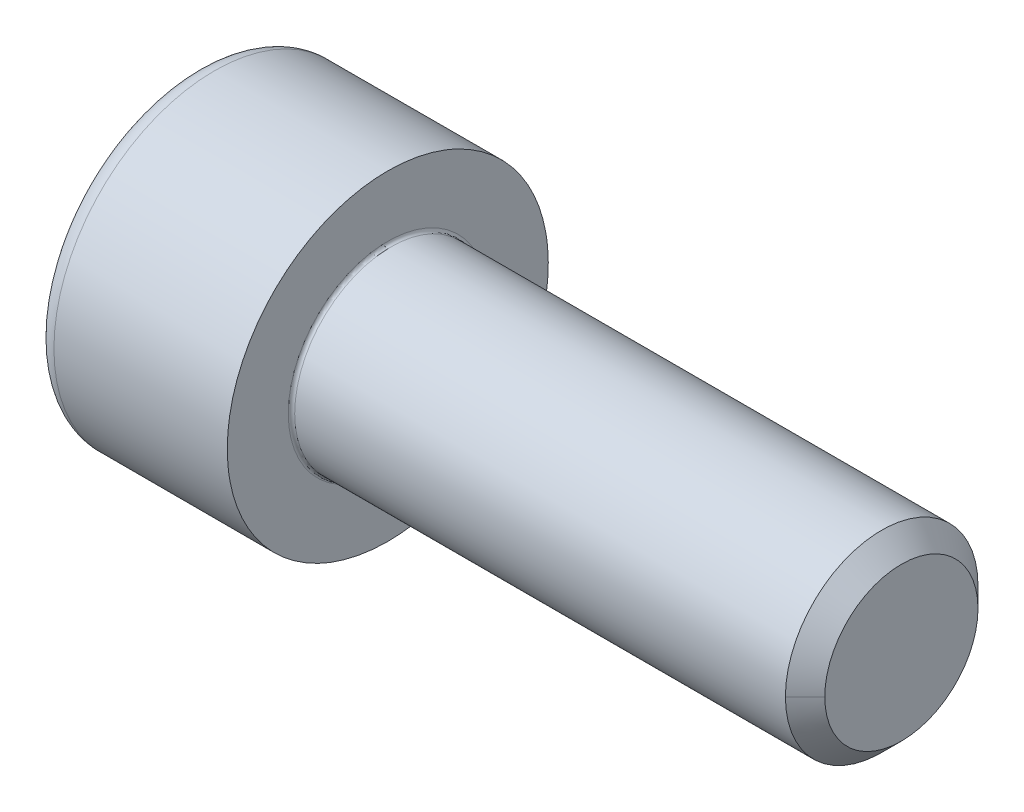
ISO-10303-21;
HEADER;
FILE_DESCRIPTION(('STEP AP214'),'2;1');
FILE_NAME('part.step','',(''),(''),'','','');
FILE_SCHEMA(('AUTOMOTIVE_DESIGN { 1 0 10303 214 1 1 1 1 }'));
ENDSEC;
DATA;
#1=APPLICATION_CONTEXT('core data for automotive mechanical design processes');
#2=APPLICATION_PROTOCOL_DEFINITION('international standard','automotive_design',2000,#1);
#3=PRODUCT_CONTEXT('',#1,'mechanical');
#4=PRODUCT('Part','Part','',(#3));
#5=PRODUCT_RELATED_PRODUCT_CATEGORY('part','',(#4));
#6=PRODUCT_DEFINITION_FORMATION('','',#4);
#7=PRODUCT_DEFINITION_CONTEXT('part definition',#1,'design');
#8=PRODUCT_DEFINITION('design','',#6,#7);
#9=PRODUCT_DEFINITION_SHAPE('','',#8);
#10=(LENGTH_UNIT() NAMED_UNIT(*) SI_UNIT(.MILLI.,.METRE.));
#11=(NAMED_UNIT(*) PLANE_ANGLE_UNIT() SI_UNIT($,.RADIAN.));
#12=(NAMED_UNIT(*) SI_UNIT($,.STERADIAN.) SOLID_ANGLE_UNIT());
#13=UNCERTAINTY_MEASURE_WITH_UNIT(LENGTH_MEASURE(1.E-05),#10,'distance_accuracy_value','');
#14=(GEOMETRIC_REPRESENTATION_CONTEXT(3) GLOBAL_UNCERTAINTY_ASSIGNED_CONTEXT((#13)) GLOBAL_UNIT_ASSIGNED_CONTEXT((#10,
#11,#12)) REPRESENTATION_CONTEXT('',''));
#15=CARTESIAN_POINT('',(0.,0.,0.));
#16=DIRECTION('',(0.,0.,1.));
#17=DIRECTION('',(1.,0.,0.));
#18=AXIS2_PLACEMENT_3D('',#15,#16,#17);
#19=CARTESIAN_POINT('',(-1.333333333,0.,0.));
#20=CARTESIAN_POINT('',(-3.01,0.,-2.904071854));
#21=(BOUNDED_CURVE() B_SPLINE_CURVE(1,(#19,#20),.UNSPECIFIED.,.F.,
.F.) B_SPLINE_CURVE_WITH_KNOTS((2,2),(0.,1.),
.UNSPECIFIED.) CURVE() GEOMETRIC_REPRESENTATION_ITEM() RATIONAL_B_SPLINE_CURVE((1.,1.)) REPRESENTATION_ITEM(''));
#22=CARTESIAN_POINT('',(996.99,0.,0.));
#23=DIRECTION('',(-1.,0.,0.));
#24=AXIS1_PLACEMENT('',#22,#23);
#25=SURFACE_OF_REVOLUTION('',#21,#24);
#26=CARTESIAN_POINT('',(-1.333333333,0.,0.));
#27=VERTEX_POINT('',#26);
#28=VERTEX_LOOP('',#27);
#29=FACE_BOUND('',#28,.T.);
#30=CARTESIAN_POINT('',(-2.99999999990194,-2.5,1.44337567259391));
#31=CARTESIAN_POINT('',(-2.98209574263693,-2.5,1.38134905294953));
#32=CARTESIAN_POINT('',(-2.96498591501795,-2.5,1.31908524854831));
#33=CARTESIAN_POINT('',(-2.9325586063815,-2.5,1.19402341340579));
#34=CARTESIAN_POINT('',(-2.91724304001177,-2.5,1.13122488732653));
#35=CARTESIAN_POINT('',(-2.88864230481174,-2.5,1.00514627159482));
#36=CARTESIAN_POINT('',(-2.87535773971234,-2.5,0.941866044598566));
#37=CARTESIAN_POINT('',(-2.84501155623976,-2.5,0.783295355537952));
#38=CARTESIAN_POINT('',(-2.82935510407788,-2.5,0.687729720023883));
#39=CARTESIAN_POINT('',(-2.8038363929103,-2.5,0.49582792968208));
#40=CARTESIAN_POINT('',(-2.79397345365601,-2.5,0.399491866661438));
#41=CARTESIAN_POINT('',(-2.78132126682311,-2.5,0.217329774455165));
#42=CARTESIAN_POINT('',(-2.77785668029329,-2.5,0.13155078285884));
#43=CARTESIAN_POINT('',(-2.77604418751081,-2.5,-0.0400958904405022));
#44=CARTESIAN_POINT('',(-2.77769824160356,-2.5,-0.125963593529663));
#45=CARTESIAN_POINT('',(-2.78605196619317,-2.5,-0.297450074329791));
#46=CARTESIAN_POINT('',(-2.79275167480722,-2.5,-0.383068850155342));
#47=CARTESIAN_POINT('',(-2.8108998117244,-2.5,-0.553755303851712));
#48=CARTESIAN_POINT('',(-2.82234605098717,-2.5,-0.638823217429646));
#49=CARTESIAN_POINT('',(-2.84954081955049,-2.5,-0.808258474159647));
#50=CARTESIAN_POINT('',(-2.86528928104194,-2.5,-0.892625828331925));
#51=CARTESIAN_POINT('',(-2.90056247218591,-2.5,-1.06053688925276));
#52=CARTESIAN_POINT('',(-2.92008612509887,-2.5,-1.14408082372909));
#53=CARTESIAN_POINT('',(-2.95044571186063,-2.5,-1.26341360873709));
#54=CARTESIAN_POINT('',(-2.95996603514937,-2.5,-1.29954359668296));
#55=CARTESIAN_POINT('',(-2.9795691964924,-2.5,-1.37159959189587));
#56=CARTESIAN_POINT('',(-2.98965127625646,-2.5,-1.40752580531338));
#57=CARTESIAN_POINT('',(-2.99999999995315,-2.5,-1.44337567277131));
#58=B_SPLINE_CURVE_WITH_KNOTS('',3,(#30,#31,#32,#33,#34,#35,#36,#37,#38,#39,#40,#41,#42,#43,#44,
#45,#46,#47,#48,#49,#50,#51,#52,#53,#54,#55,#56,#57),.UNSPECIFIED.,.F.,.F.,(4,2,2,2,2,2,2,2,2,2,
2,2,2,4),(0.,0.193683427773067,0.38757168712609,0.581517469676064,0.871873940003063,
1.16219631114209,1.41959520256128,1.67709268522974,1.93459211317248,2.1919729174537,
2.44934966528471,2.70665311350898,2.81873929256059,2.93067767377976),.UNSPECIFIED.);
#59=CARTESIAN_POINT('',(-2.9999999999511,-2.49999999997164,1.44337567281333));
#60=VERTEX_POINT('',#59);
#61=CARTESIAN_POINT('',(-2.99999999982495,-2.49999999989483,-1.44337567306072));
#62=VERTEX_POINT('',#61);
#63=EDGE_CURVE('E135',#60,#62,#58,.T.);
#64=ORIENTED_EDGE('',*,*,#63,.F.);
#65=CARTESIAN_POINT('',(-2.99999999981082,-6.92430306305458E-10,2.88675134560023));
#66=CARTESIAN_POINT('',(-2.98209574255005,-0.0537166290131819,2.85573803577872));
#67=CARTESIAN_POINT('',(-2.96498591493549,-0.107638665358749,2.8246061335788));
#68=CARTESIAN_POINT('',(-2.93255860630814,-0.215945391631711,2.76207521600893));
#69=CARTESIAN_POINT('',(-2.9172430399431,-0.270330510534358,2.73067595297002));
#70=CARTESIAN_POINT('',(-2.88864230475259,-0.379517794627478,2.66763664510564));
#71=CARTESIAN_POINT('',(-2.87535773965803,-0.43432007876117,2.63599653160827));
#72=CARTESIAN_POINT('',(-2.84501155619788,-0.571646323777089,2.55671118708011));
#73=CARTESIAN_POINT('',(-2.82935510404371,-0.654408591857143,2.50892836932449));
#74=CARTESIAN_POINT('',(-2.8038363928916,-0.820600417316618,2.41297747415662));
#75=CARTESIAN_POINT('',(-2.79397345364506,-0.904029895188767,2.36480944264792));
#76=CARTESIAN_POINT('',(-2.78132126682574,-1.06178689464532,2.27372839654349));
#77=CARTESIAN_POINT('',(-2.77785668030231,-1.13607368048253,2.23083890074238));
#78=CARTESIAN_POINT('',(-2.7760441875333,-1.28472406004208,2.14501556408699));
#79=CARTESIAN_POINT('',(-2.77769824163313,-1.35908767228535,2.10208171253965));
#80=CARTESIAN_POINT('',(-2.78605196623694,-1.5075993210704,2.01633847213427));
#81=CARTESIAN_POINT('',(-2.79275167485812,-1.58174735597935,1.97352908421893));
#82=CARTESIAN_POINT('',(-2.81089981178956,-1.72956616096821,1.88818585736579));
#83=CARTESIAN_POINT('',(-2.82234605105948,-1.80323713517648,1.84565190057442));
#84=CARTESIAN_POINT('',(-2.84954081963674,-1.94997237180682,1.76093427220477));
#85=CARTESIAN_POINT('',(-2.86528928113499,-2.02303664377268,1.71875059511638));
#86=CARTESIAN_POINT('',(-2.90056247229208,-2.16845188811155,1.63479506465155));
#87=CARTESIAN_POINT('',(-2.92008612521135,-2.2408030577026,1.59302309741122));
#88=CARTESIAN_POINT('',(-2.95044571196894,-2.34414828098353,1.53335670492944));
#89=CARTESIAN_POINT('',(-2.95996603524654,-2.37543776834049,1.51529171098077));
#90=CARTESIAN_POINT('',(-2.9795691965657,-2.43784009060514,1.47926371342257));
#91=CARTESIAN_POINT('',(-2.98965127631702,-2.46895310404436,1.46130060673781));
#92=CARTESIAN_POINT('',(-3.00000000000026,-2.49999999994328,1.44337567303274));
#93=B_SPLINE_CURVE_WITH_KNOTS('',3,(#65,#66,#67,#68,#69,#70,#71,#72,#73,#74,#75,#76,#77,#78,#79,
#80,#81,#82,#83,#84,#85,#86,#87,#88,#89,#90,#91,#92),.UNSPECIFIED.,.F.,.F.,(4,2,2,2,2,2,2,2,2,2,
2,2,2,4),(0.,0.193683427763163,0.387571687106229,0.581517469646224,0.871873939957275,
1.16219631108039,1.41959520251302,1.67709268519497,1.93459211315123,2.19197291744619,
2.44934966529089,2.70665311352883,2.8187392924298,2.93067767349862),.UNSPECIFIED.);
#94=CARTESIAN_POINT('',(-3.00000000004163,-1.18416519667169E-09,2.886751346));
#95=VERTEX_POINT('',#94);
#96=EDGE_CURVE('E57',#95,#60,#93,.T.);
#97=ORIENTED_EDGE('',*,*,#96,.F.);
#98=CARTESIAN_POINT('',(-3.00000000004014,2.50000000006292,1.44337567296367));
#99=CARTESIAN_POINT('',(-2.98209574277019,2.44628337173678,1.47438898278829));
#100=CARTESIAN_POINT('',(-2.96498591514619,2.39236133538579,1.50552088499134));
#101=CARTESIAN_POINT('',(-2.93255860649956,2.28405460910186,1.56805180256754));
#102=CARTESIAN_POINT('',(-2.91724304012469,2.22966949019366,1.59945106560966));
#103=CARTESIAN_POINT('',(-2.88864230491419,2.12048220608924,1.66249037348057));
#104=CARTESIAN_POINT('',(-2.87535773980948,2.0656799219498,1.69413048698125));
#105=CARTESIAN_POINT('',(-2.8450115563234,1.92835367691897,1.77341583151802));
#106=CARTESIAN_POINT('',(-2.82935510415318,1.84559140882962,1.82119864927901));
#107=CARTESIAN_POINT('',(-2.80383639296923,1.67939958335076,1.91714954445807));
#108=CARTESIAN_POINT('',(-2.7939734537069,1.59597010546853,1.96531757597259));
#109=CARTESIAN_POINT('',(-2.78132126685985,1.43821310600813,2.05639862207924));
#110=CARTESIAN_POINT('',(-2.77785668032333,1.36392632017731,2.09928811787666));
#111=CARTESIAN_POINT('',(-2.77604418752705,1.21527594062986,2.18511145452507));
#112=CARTESIAN_POINT('',(-2.7776982416127,1.14091232839229,2.22804530606911));
#113=CARTESIAN_POINT('',(-2.78605196618806,0.992400679617963,2.31378854646831));
#114=CARTESIAN_POINT('',(-2.79275167479497,0.918252644714026,2.35659793438075));
#115=CARTESIAN_POINT('',(-2.81089981169805,0.77043383973447,2.44194116122851));
#116=CARTESIAN_POINT('',(-2.82234605095387,0.696762865530502,2.4844751180174));
#117=CARTESIAN_POINT('',(-2.84954081950371,0.55002762890825,2.56919274638238));
#118=CARTESIAN_POINT('',(-2.86528928098864,0.476963356946185,2.61137642346858));
#119=CARTESIAN_POINT('',(-2.90056247212028,0.331548112614633,2.69533195392919));
#120=CARTESIAN_POINT('',(-2.92008612502744,0.259196943027112,2.73710392116748));
#121=CARTESIAN_POINT('',(-2.95044571181407,0.155851719595239,2.79677031373641));
#122=CARTESIAN_POINT('',(-2.95996603513553,0.124562232084562,2.81483530777383));
#123=CARTESIAN_POINT('',(-2.97956919654802,0.0621599095141735,2.85086330550854));
#124=CARTESIAN_POINT('',(-2.98965127634881,0.0310468959229215,2.86882641228108));
#125=CARTESIAN_POINT('',(-3.00000000008409,-1.27376694826501E-10,2.88675134607354));
#126=B_SPLINE_CURVE_WITH_KNOTS('',3,(#98,#99,#100,#101,#102,#103,#104,#105,#106,#107,#108,#109,
#110,#111,#112,#113,#114,#115,#116,#117,#118,#119,#120,#121,#122,#123,#124,#125),.UNSPECIFIED.,
.F.,.F.,(4,2,2,2,2,2,2,2,2,2,2,2,2,4),(0.,0.193683427788764,0.387571687157534,0.581517469723277,
0.87187394007394,1.16219631123659,1.41959520264876,1.67709268531015,1.93459211324574,
2.19197291752029,2.44934966534468,2.70665311356242,2.81873929301174,2.93067767462766),.UNSPECIFIED.);
#127=CARTESIAN_POINT('',(-2.9999999998705,2.50000000003146,1.44337567298184));
#128=VERTEX_POINT('',#127);
#129=EDGE_CURVE('E555',#128,#95,#126,.T.);
#130=ORIENTED_EDGE('',*,*,#129,.F.);
#131=CARTESIAN_POINT('',(-2.99999999999303,2.5,-1.44337567290945));
#132=CARTESIAN_POINT('',(-2.98209574272447,2.5,-1.38134905326268));
#133=CARTESIAN_POINT('',(-2.96498591510176,2.5,-1.31908524885907));
#134=CARTESIAN_POINT('',(-2.93255860645764,2.5,-1.19402341371172));
#135=CARTESIAN_POINT('',(-2.91724304008399,2.5,-1.13122488763002));
#136=CARTESIAN_POINT('',(-2.88864230487602,2.5,-1.00514627189332));
#137=CARTESIAN_POINT('',(-2.87535773977261,2.5,-0.94186604489453));
#138=CARTESIAN_POINT('',(-2.84501155628974,2.5,-0.783295355827017));
#139=CARTESIAN_POINT('',(-2.82935510412148,2.5,-0.687729720308527));
#140=CARTESIAN_POINT('',(-2.80383639294123,2.5,-0.495827929957529));
#141=CARTESIAN_POINT('',(-2.79397345368064,2.5,-0.399491866932111));
#142=CARTESIAN_POINT('',(-2.78132126683661,2.5,-0.217329774723812));
#143=CARTESIAN_POINT('',(-2.7778566803015,2.5,-0.131550783130307));
#144=CARTESIAN_POINT('',(-2.77604418750818,2.5,0.0400958901637057));
#145=CARTESIAN_POINT('',(-2.77769824159537,2.5,0.125963593250358));
#146=CARTESIAN_POINT('',(-2.7860519661738,2.5,0.29745007404579));
#147=CARTESIAN_POINT('',(-2.79275167478224,2.5,0.383068849869153));
#148=CARTESIAN_POINT('',(-2.81089981168823,2.5,0.553755303561258));
#149=CARTESIAN_POINT('',(-2.82234605094543,2.5,0.638823217137117));
#150=CARTESIAN_POINT('',(-2.84954081949781,2.5,0.808258473863209));
#151=CARTESIAN_POINT('',(-2.8652892809839,2.5,0.892625828033653));
#152=CARTESIAN_POINT('',(-2.90056247211773,2.5,1.06053688895091));
#153=CARTESIAN_POINT('',(-2.9200861250259,2.5,1.14408082342549));
#154=CARTESIAN_POINT('',(-2.95044571178066,2.5,1.26341360843007));
#155=CARTESIAN_POINT('',(-2.95996603506711,2.5,1.29954359637421));
#156=CARTESIAN_POINT('',(-2.97956919640564,2.5,1.37159959158371));
#157=CARTESIAN_POINT('',(-2.9896512761675,2.5,1.40752580499953));
#158=CARTESIAN_POINT('',(-2.99999999986206,2.5,1.44337567245577));
#159=B_SPLINE_CURVE_WITH_KNOTS('',3,(#131,#132,#133,#134,#135,#136,#137,#138,#139,#140,#141,
#142,#143,#144,#145,#146,#147,#148,#149,#150,#151,#152,#153,#154,#155,#156,#157,#158),
.UNSPECIFIED.,.F.,.F.,(4,2,2,2,2,2,2,2,2,2,2,2,2,4),(0.,0.193683427782941,0.387571687145881,
0.581517469705791,0.871873940048986,1.16219631120418,1.41959520261558,1.6770926852762,
1.93459211321108,2.19197291748389,2.44934966530652,2.70665311352239,2.81873929256726,
2.93067767377976),.UNSPECIFIED.);
#160=CARTESIAN_POINT('',(-2.99999999984694,2.5,-1.44337567295473));
#161=VERTEX_POINT('',#160);
#162=EDGE_CURVE('E149',#161,#128,#159,.T.);
#163=ORIENTED_EDGE('',*,*,#162,.F.);
#164=CARTESIAN_POINT('',(-2.99999999997736,1.9280147525356E-10,-2.88675134588869));
#165=CARTESIAN_POINT('',(-2.98209574271006,0.05371662851739,-2.85573803606497));
#166=CARTESIAN_POINT('',(-2.96498591508868,0.107638664866787,-2.82460613386283));
#167=CARTESIAN_POINT('',(-2.93255860644731,0.215945391147497,-2.76207521628849));
#168=CARTESIAN_POINT('',(-2.91724304007509,0.27033051005406,-2.73067595324732));
#169=CARTESIAN_POINT('',(-2.88864230487006,0.379517794155173,-2.66763664537832));
#170=CARTESIAN_POINT('',(-2.87535773976816,0.434320078292939,-2.63599653187861));
#171=CARTESIAN_POINT('',(-2.8450115562892,0.57164632331975,-2.55671118734415));
#172=CARTESIAN_POINT('',(-2.82935510412338,0.65440859140672,-2.50892836958454));
#173=CARTESIAN_POINT('',(-2.80383639294808,0.820600416880588,-2.41297747440836));
#174=CARTESIAN_POINT('',(-2.79397345369,0.904029894760213,-2.36480944289534));
#175=CARTESIAN_POINT('',(-2.78132126685048,1.06178689421983,-2.27372839678915));
#176=CARTESIAN_POINT('',(-2.77785668031755,1.13607368005252,-2.23083890099064));
#177=CARTESIAN_POINT('',(-2.77604418752874,1.28472405960351,-2.1450155643402));
#178=CARTESIAN_POINT('',(-2.77769824161827,1.35908767184276,-2.10208171279518));
#179=CARTESIAN_POINT('',(-2.78605196620148,1.50759932062025,-2.01633847239416));
#180=CARTESIAN_POINT('',(-2.79275167481235,1.58174735552568,-1.97352908448086));
#181=CARTESIAN_POINT('',(-2.81089981172326,1.7295661605078,-1.88818585763161));
#182=CARTESIAN_POINT('',(-2.82234605098294,1.80323713471284,-1.84565190084211));
#183=CARTESIAN_POINT('',(-2.8495408195403,1.94997237133708,-1.76093427247597));
#184=CARTESIAN_POINT('',(-2.86528928102888,2.02303664330007,-1.71875059538924));
#185=CARTESIAN_POINT('',(-2.90056247216742,2.1684518876334,-1.63479506492761));
#186=CARTESIAN_POINT('',(-2.92008612507781,2.24080305722177,-1.59302309768883));
#187=CARTESIAN_POINT('',(-2.95044571183394,2.34414828053542,-1.53335670518816));
#188=CARTESIAN_POINT('',(-2.95996603511936,2.37543776792759,-1.51529171121916));
#189=CARTESIAN_POINT('',(-2.97956919645556,2.4378400902623,-1.47926371362051));
#190=CARTESIAN_POINT('',(-2.9896512762161,2.46895310373638,-1.46130060691562));
#191=CARTESIAN_POINT('',(-2.99999999990917,2.49999999967002,-1.44337567319052));
#192=B_SPLINE_CURVE_WITH_KNOTS('',3,(#164,#165,#166,#167,#168,#169,#170,#171,#172,#173,#174,
#175,#176,#177,#178,#179,#180,#181,#182,#183,#184,#185,#186,#187,#188,#189,#190,#191),
.UNSPECIFIED.,.F.,.F.,(4,2,2,2,2,2,2,2,2,2,2,2,2,4),(0.,0.193683427781386,0.387571687142756,
0.581517469701091,0.871873940041472,1.16219631119386,1.41959520261202,1.67709268527943,
1.93459211322111,2.19197291750089,2.44934966533046,2.70665311355327,2.81873929257813,
2.93067767377066),.UNSPECIFIED.);
#193=CARTESIAN_POINT('',(-2.99999999992309,-1.62810287891242E-10,-2.88675134579469));
#194=VERTEX_POINT('',#193);
#195=EDGE_CURVE('E130',#194,#161,#192,.T.);
#196=ORIENTED_EDGE('',*,*,#195,.F.);
#197=CARTESIAN_POINT('',(-2.99999999994905,-2.49999999978965,-1.44337567312145));
#198=CARTESIAN_POINT('',(-2.98209574268285,-2.44628337146572,-1.47438898294478));
#199=CARTESIAN_POINT('',(-2.96498591506263,-2.39236133511698,-1.50552088514654));
#200=CARTESIAN_POINT('',(-2.93255860642365,-2.2840546088376,-1.56805180272011));
#201=CARTESIAN_POINT('',(-2.91724304005265,-2.22966948993171,-1.5994510657609));
#202=CARTESIAN_POINT('',(-2.88864230485011,-2.12048220583196,-1.66249037362911));
#203=CARTESIAN_POINT('',(-2.87535773974946,-2.06567992169489,-1.69413048712842));
#204=CARTESIAN_POINT('',(-2.84501155627371,-1.92835367666992,-1.77341583166181));
#205=CARTESIAN_POINT('',(-2.82935510410985,-1.84559140858412,-1.82119864942075));
#206=CARTESIAN_POINT('',(-2.80383639293848,-1.67939958311269,-1.91714954459552));
#207=CARTESIAN_POINT('',(-2.79397345368236,-1.59597010523433,-1.96531757610781));
#208=CARTESIAN_POINT('',(-2.78132126684628,-1.43821310577522,-2.05639862221371));
#209=CARTESIAN_POINT('',(-2.77785668031497,-1.36392631994176,-2.09928811801266));
#210=CARTESIAN_POINT('',(-2.77604418752952,-1.2152759403893,-2.18511145466395));
#211=CARTESIAN_POINT('',(-2.77769824162078,-1.14091232814936,-2.22804530620937));
#212=CARTESIAN_POINT('',(-2.78605196620749,-0.992400679370574,-2.31378854661114));
#213=CARTESIAN_POINT('',(-2.79275167482015,-0.918252644464542,-2.35659793452478));
#214=CARTESIAN_POINT('',(-2.81089981173457,-0.770433839481277,-2.44194116137469));
#215=CARTESIAN_POINT('',(-2.82234605099598,-0.696762865275693,-2.48447511816451));
#216=CARTESIAN_POINT('',(-2.8495408195567,-0.550027628650418,-2.56919274653124));
#217=CARTESIAN_POINT('',(-2.86528928104691,-0.476963356686943,-2.61137642361826));
#218=CARTESIAN_POINT('',(-2.90056247218859,-0.331548112352686,-2.69533195408042));
#219=CARTESIAN_POINT('',(-2.9200861251005,-0.259196942763867,-2.73710392131946));
#220=CARTESIAN_POINT('',(-2.95044571185584,-0.155851719459382,-2.79677031381484));
#221=CARTESIAN_POINT('',(-2.95996603513881,-0.124562232076772,-2.81483530777832));
#222=CARTESIAN_POINT('',(-2.97956919646974,-0.0621599097610845,-2.85086330536599));
#223=CARTESIAN_POINT('',(-2.98965127622746,-0.0310468962964689,-2.86882641206541));
#224=CARTESIAN_POINT('',(-2.99999999991754,-3.72252951759761E-10,-2.88675134578508));
#225=B_SPLINE_CURVE_WITH_KNOTS('',3,(#197,#198,#199,#200,#201,#202,#203,#204,#205,#206,#207,
#208,#209,#210,#211,#212,#213,#214,#215,#216,#217,#218,#219,#220,#221,#222,#223,#224),
.UNSPECIFIED.,.F.,.F.,(4,2,2,2,2,2,2,2,2,2,2,2,2,4),(0.,0.193683427778269,0.387571687136511,
0.581517469691713,0.871873940027135,1.16219631117457,1.41959520259521,1.67709268526511,
1.93459211320929,2.19197291749163,2.44934966532376,2.70665311354912,2.81873929254008,
2.93067767369877),.UNSPECIFIED.);
#226=EDGE_CURVE('E136',#62,#194,#225,.T.);
#227=ORIENTED_EDGE('',*,*,#226,.F.);
#228=EDGE_LOOP('',(#64,#97,#130,#163,#196,#227));
#229=FACE_BOUND('',#228,.T.);
#230=ADVANCED_FACE('F53',(#29,#229),#25,.F.);
#231=CARTESIAN_POINT('',(-6.,-2.5,1.443375673));
#232=DIRECTION('',(0.,-0.500000000006738,0.866025403780548));
#233=DIRECTION('',(0.,0.866025403780548,0.500000000006738));
#234=AXIS2_PLACEMENT_3D('',#231,#232,#233);
#235=PLANE('',#234);
#236=DIRECTION('',(0.,0.866025403780548,0.500000000006738));
#237=VECTOR('',#236,1.);
#238=CARTESIAN_POINT('',(-6.,-2.50000000332919,1.44337567107789));
#239=LINE('',#238,#237);
#240=CARTESIAN_POINT('',(-6.,-2.5,1.443375673));
#241=VERTEX_POINT('',#240);
#242=CARTESIAN_POINT('',(-6.,0.,2.886751346));
#243=VERTEX_POINT('',#242);
#244=EDGE_CURVE('E263',#241,#243,#239,.T.);
#245=ORIENTED_EDGE('',*,*,#244,.T.);
#246=DIRECTION('',(1.,0.,0.));
#247=VECTOR('',#246,1.);
#248=CARTESIAN_POINT('',(-6.,0.,2.886751346));
#249=LINE('',#248,#247);
#250=EDGE_CURVE('E552',#95,#243,#249,.F.);
#251=ORIENTED_EDGE('',*,*,#250,.F.);
#252=ORIENTED_EDGE('',*,*,#96,.T.);
#253=DIRECTION('',(1.,0.,0.));
#254=VECTOR('',#253,1.);
#255=CARTESIAN_POINT('',(-6.,-2.5,1.443375673));
#256=LINE('',#255,#254);
#257=EDGE_CURVE('E266',#241,#60,#256,.T.);
#258=ORIENTED_EDGE('',*,*,#257,.F.);
#259=EDGE_LOOP('',(#245,#251,#252,#258));
#260=FACE_BOUND('',#259,.T.);
#261=ADVANCED_FACE('F168',(#260),#235,.F.);
#262=CARTESIAN_POINT('',(-6.,0.,2.886751346));
#263=DIRECTION('',(0.,0.500000000006738,0.866025403780548));
#264=DIRECTION('',(0.,0.866025403780548,-0.500000000006738));
#265=AXIS2_PLACEMENT_3D('',#262,#263,#264);
#266=PLANE('',#265);
#267=DIRECTION('',(0.,0.866025403780548,-0.500000000006738));
#268=VECTOR('',#267,1.);
#269=CARTESIAN_POINT('',(-6.,3.35008062957165E-10,2.88675134580658));
#270=LINE('',#269,#268);
#271=CARTESIAN_POINT('',(-6.,2.5,1.443375673));
#272=VERTEX_POINT('',#271);
#273=EDGE_CURVE('E260',#243,#272,#270,.T.);
#274=ORIENTED_EDGE('',*,*,#273,.T.);
#275=DIRECTION('',(1.,0.,0.));
#276=VECTOR('',#275,1.);
#277=CARTESIAN_POINT('',(-6.,2.5,1.443375673));
#278=LINE('',#277,#276);
#279=EDGE_CURVE('E150',#128,#272,#278,.F.);
#280=ORIENTED_EDGE('',*,*,#279,.F.);
#281=ORIENTED_EDGE('',*,*,#129,.T.);
#282=ORIENTED_EDGE('',*,*,#250,.T.);
#283=EDGE_LOOP('',(#274,#280,#281,#282));
#284=FACE_BOUND('',#283,.T.);
#285=ADVANCED_FACE('F391',(#284),#266,.F.);
#286=CARTESIAN_POINT('',(-6.,2.5,1.443375673));
#287=DIRECTION('',(0.,1.,0.));
#288=DIRECTION('',(0.,0.,-1.));
#289=AXIS2_PLACEMENT_3D('',#286,#287,#288);
#290=PLANE('',#289);
#291=DIRECTION('',(0.,0.,-1.));
#292=VECTOR('',#291,1.);
#293=CARTESIAN_POINT('',(-6.,2.5,4.452851156));
#294=LINE('',#293,#292);
#295=CARTESIAN_POINT('',(-6.,2.5,-1.443375673));
#296=VERTEX_POINT('',#295);
#297=EDGE_CURVE('E257',#272,#296,#294,.T.);
#298=ORIENTED_EDGE('',*,*,#297,.T.);
#299=DIRECTION('',(1.,0.,0.));
#300=VECTOR('',#299,1.);
#301=CARTESIAN_POINT('',(-6.,2.5,-1.443375673));
#302=LINE('',#301,#300);
#303=EDGE_CURVE('E145',#161,#296,#302,.F.);
#304=ORIENTED_EDGE('',*,*,#303,.F.);
#305=ORIENTED_EDGE('',*,*,#162,.T.);
#306=ORIENTED_EDGE('',*,*,#279,.T.);
#307=EDGE_LOOP('',(#298,#304,#305,#306));
#308=FACE_BOUND('',#307,.T.);
#309=ADVANCED_FACE('F382',(#308),#290,.F.);
#310=CARTESIAN_POINT('',(-6.,2.5,-1.443375673));
#311=DIRECTION('',(0.,0.500000000006738,-0.866025403780548));
#312=DIRECTION('',(0.,-0.866025403780548,-0.500000000006738));
#313=AXIS2_PLACEMENT_3D('',#310,#311,#312);
#314=PLANE('',#313);
#315=DIRECTION('',(0.,-0.866025403780548,-0.500000000006738));
#316=VECTOR('',#315,1.);
#317=CARTESIAN_POINT('',(-6.,2.50000000218616,-1.44337567173782));
#318=LINE('',#317,#316);
#319=CARTESIAN_POINT('',(-6.,0.,-2.886751346));
#320=VERTEX_POINT('',#319);
#321=EDGE_CURVE('E132',#296,#320,#318,.T.);
#322=ORIENTED_EDGE('',*,*,#321,.T.);
#323=DIRECTION('',(1.,0.,0.));
#324=VECTOR('',#323,1.);
#325=CARTESIAN_POINT('',(-6.,0.,-2.886751346));
#326=LINE('',#325,#324);
#327=EDGE_CURVE('E125',#194,#320,#326,.F.);
#328=ORIENTED_EDGE('',*,*,#327,.F.);
#329=ORIENTED_EDGE('',*,*,#195,.T.);
#330=ORIENTED_EDGE('',*,*,#303,.T.);
#331=EDGE_LOOP('',(#322,#328,#329,#330));
#332=FACE_BOUND('',#331,.T.);
#333=ADVANCED_FACE('F127',(#332),#314,.F.);
#334=CARTESIAN_POINT('',(-6.,0.,-2.886751346));
#335=DIRECTION('',(0.,-0.500000000006738,-0.866025403780548));
#336=DIRECTION('',(0.,-0.866025403780548,0.500000000006738));
#337=AXIS2_PLACEMENT_3D('',#334,#335,#336);
#338=PLANE('',#337);
#339=DIRECTION('',(0.,-0.866025403780548,0.500000000006738));
#340=VECTOR('',#339,1.);
#341=CARTESIAN_POINT('',(-6.,-1.47803644323652E-09,-2.88675134514666));
#342=LINE('',#341,#340);
#343=CARTESIAN_POINT('',(-6.,-2.5,-1.443375673));
#344=VERTEX_POINT('',#343);
#345=EDGE_CURVE('E254',#320,#344,#342,.T.);
#346=ORIENTED_EDGE('',*,*,#345,.T.);
#347=DIRECTION('',(1.,0.,0.));
#348=VECTOR('',#347,1.);
#349=CARTESIAN_POINT('',(-6.,-2.5,-1.443375673));
#350=LINE('',#349,#348);
#351=EDGE_CURVE('E141',#62,#344,#350,.F.);
#352=ORIENTED_EDGE('',*,*,#351,.F.);
#353=ORIENTED_EDGE('',*,*,#226,.T.);
#354=ORIENTED_EDGE('',*,*,#327,.T.);
#355=EDGE_LOOP('',(#346,#352,#353,#354));
#356=FACE_BOUND('',#355,.T.);
#357=ADVANCED_FACE('F139',(#356),#338,.F.);
#358=CARTESIAN_POINT('',(-6.,-2.5,-1.443375673));
#359=DIRECTION('',(0.,-1.,0.));
#360=DIRECTION('',(0.,0.,1.));
#361=AXIS2_PLACEMENT_3D('',#358,#359,#360);
#362=PLANE('',#361);
#363=DIRECTION('',(0.,0.,-1.));
#364=VECTOR('',#363,1.);
#365=CARTESIAN_POINT('',(-6.,-2.5,4.452851156));
#366=LINE('',#365,#364);
#367=EDGE_CURVE('E250',#344,#241,#366,.F.);
#368=ORIENTED_EDGE('',*,*,#367,.T.);
#369=ORIENTED_EDGE('',*,*,#257,.T.);
#370=ORIENTED_EDGE('',*,*,#63,.T.);
#371=ORIENTED_EDGE('',*,*,#351,.T.);
#372=EDGE_LOOP('',(#368,#369,#370,#371));
#373=FACE_BOUND('',#372,.T.);
#374=ADVANCED_FACE('F274',(#373),#362,.F.);
#375=CARTESIAN_POINT('',(-6.,4.452800303,4.452851156));
#376=DIRECTION('',(-1.,0.,0.));
#377=DIRECTION('',(0.,-1.,0.));
#378=AXIS2_PLACEMENT_3D('',#375,#376,#377);
#379=PLANE('',#378);
#380=ORIENTED_EDGE('',*,*,#345,.F.);
#381=ORIENTED_EDGE('',*,*,#321,.F.);
#382=ORIENTED_EDGE('',*,*,#297,.F.);
#383=ORIENTED_EDGE('',*,*,#273,.F.);
#384=ORIENTED_EDGE('',*,*,#244,.F.);
#385=ORIENTED_EDGE('',*,*,#367,.F.);
#386=EDGE_LOOP('',(#380,#381,#382,#383,#384,#385));
#387=FACE_BOUND('',#386,.T.);
#388=CARTESIAN_POINT('',(-6.,0.,0.));
#389=DIRECTION('',(-1.,0.,0.));
#390=DIRECTION('',(0.,1.,0.));
#391=AXIS2_PLACEMENT_3D('',#388,#389,#390);
#392=CIRCLE('',#391,4.4);
#393=CARTESIAN_POINT('',(-6.,4.4,0.));
#394=VERTEX_POINT('',#393);
#395=EDGE_CURVE('E246',#394,#394,#392,.T.);
#396=ORIENTED_EDGE('',*,*,#395,.T.);
#397=EDGE_LOOP('',(#396));
#398=FACE_BOUND('',#397,.T.);
#399=ADVANCED_FACE('F278',(#387,#398),#379,.T.);
#400=CARTESIAN_POINT('',(16.,-2.4151886,2.4151886));
#401=DIRECTION('',(1.,0.,0.));
#402=DIRECTION('',(0.,1.,0.));
#403=AXIS2_PLACEMENT_3D('',#400,#401,#402);
#404=PLANE('',#403);
#405=CARTESIAN_POINT('',(16.,0.,0.));
#406=DIRECTION('',(1.,0.,0.));
#407=DIRECTION('',(0.,0.,-1.));
#408=AXIS2_PLACEMENT_3D('',#405,#406,#407);
#409=CIRCLE('',#408,2.38655);
#410=CARTESIAN_POINT('',(16.,-8.15815978930554E-10,2.38655000001316));
#411=VERTEX_POINT('',#410);
#412=CARTESIAN_POINT('',(16.,-7.14319747073452E-11,-2.38655000001316));
#413=VERTEX_POINT('',#412);
#414=EDGE_CURVE('E244',#411,#413,#409,.F.);
#415=ORIENTED_EDGE('',*,*,#414,.F.);
#416=CARTESIAN_POINT('',(16.,0.,0.));
#417=DIRECTION('',(1.,0.,0.));
#418=DIRECTION('',(0.,0.,-1.));
#419=AXIS2_PLACEMENT_3D('',#416,#417,#418);
#420=CIRCLE('',#419,2.38655);
#421=EDGE_CURVE('E236',#413,#411,#420,.F.);
#422=ORIENTED_EDGE('',*,*,#421,.F.);
#423=EDGE_LOOP('',(#415,#422));
#424=FACE_BOUND('',#423,.T.);
#425=ADVANCED_FACE('F245',(#424),#404,.T.);
#426=CARTESIAN_POINT('',(-5.4,0.,0.));
#427=DIRECTION('',(1.,0.,0.));
#428=DIRECTION('',(0.,1.,0.));
#429=AXIS2_PLACEMENT_3D('',#426,#427,#428);
#430=TOROIDAL_SURFACE('',#429,4.4,0.599999999999999);
#431=ORIENTED_EDGE('',*,*,#395,.F.);
#432=EDGE_LOOP('',(#431));
#433=FACE_BOUND('',#432,.T.);
#434=CARTESIAN_POINT('',(-5.4,0.,0.));
#435=DIRECTION('',(-1.,0.,0.));
#436=DIRECTION('',(0.,1.,0.));
#437=AXIS2_PLACEMENT_3D('',#434,#435,#436);
#438=CIRCLE('',#437,5.);
#439=CARTESIAN_POINT('',(-5.4,5.,0.));
#440=VERTEX_POINT('',#439);
#441=EDGE_CURVE('E293',#440,#440,#438,.F.);
#442=ORIENTED_EDGE('',*,*,#441,.F.);
#443=EDGE_LOOP('',(#442));
#444=FACE_BOUND('',#443,.T.);
#445=ADVANCED_FACE('F232',(#433,#444),#430,.T.);
#446=CARTESIAN_POINT('',(16.0001414213562,0.,-2.38640857864376));
#447=CARTESIAN_POINT('',(16.,0.,-2.38655));
#448=CARTESIAN_POINT('',(15.38655,0.,-3.));
#449=(BOUNDED_CURVE() B_SPLINE_CURVE(1,(#446,#447,#448),.UNSPECIFIED.,.F.,
.F.) B_SPLINE_CURVE_WITH_KNOTS((2,1,2),(-0.000230534385736213,6.0801745359364E-11,1.),
.UNSPECIFIED.) CURVE() GEOMETRIC_REPRESENTATION_ITEM() RATIONAL_B_SPLINE_CURVE((1.,1.,1.)) REPRESENTATION_ITEM(''));
#450=CARTESIAN_POINT('',(1015.38655,0.,0.));
#451=DIRECTION('',(-1.,0.,0.));
#452=AXIS1_PLACEMENT('',#450,#451);
#453=SURFACE_OF_REVOLUTION('',#449,#452);
#454=DIRECTION('',(-0.707106781216905,-2.90060050283392E-10,0.70710678115619));
#455=VECTOR('',#454,1.);
#456=CARTESIAN_POINT('',(15.6933457106781,-1.10477086686423E-09,2.69320428932188));
#457=LINE('',#456,#455);
#458=CARTESIAN_POINT('',(15.3865500000001,-1.23062057108661E-09,2.99999999998677));
#459=VERTEX_POINT('',#458);
#460=EDGE_CURVE('E238',#411,#459,#457,.T.);
#461=ORIENTED_EDGE('',*,*,#460,.F.);
#462=ORIENTED_EDGE('',*,*,#414,.T.);
#463=DIRECTION('',(0.707106781216905,0.,0.70710678115619));
#464=VECTOR('',#463,1.);
#465=CARTESIAN_POINT('',(15.6933457106781,0.,-2.69320428932188));
#466=LINE('',#465,#464);
#467=CARTESIAN_POINT('',(15.3865500000001,-2.6937955301857E-10,-2.99999999998677));
#468=VERTEX_POINT('',#467);
#469=EDGE_CURVE('E240',#468,#413,#466,.T.);
#470=ORIENTED_EDGE('',*,*,#469,.F.);
#471=CARTESIAN_POINT('',(15.3865500000001,0.,0.));
#472=DIRECTION('',(1.,0.,0.));
#473=DIRECTION('',(0.,0.,-1.));
#474=AXIS2_PLACEMENT_3D('',#471,#472,#473);
#475=CIRCLE('',#474,3.);
#476=EDGE_CURVE('E294',#459,#468,#475,.F.);
#477=ORIENTED_EDGE('',*,*,#476,.F.);
#478=EDGE_LOOP('',(#461,#462,#470,#477));
#479=FACE_BOUND('',#478,.T.);
#480=ADVANCED_FACE('F170',(#479),#453,.T.);
#481=CARTESIAN_POINT('',(16.,0.,-2.38655));
#482=CARTESIAN_POINT('',(15.38655,0.,-3.));
#483=(BOUNDED_CURVE() B_SPLINE_CURVE(1,(#481,#482),.UNSPECIFIED.,.F.,
.F.) B_SPLINE_CURVE_WITH_KNOTS((2,2),(0.,0.999999999999907),
.UNSPECIFIED.) CURVE() GEOMETRIC_REPRESENTATION_ITEM() RATIONAL_B_SPLINE_CURVE((1.,1.)) REPRESENTATION_ITEM(''));
#484=CARTESIAN_POINT('',(1015.38655,0.,0.));
#485=DIRECTION('',(-1.,0.,0.));
#486=AXIS1_PLACEMENT('',#484,#485);
#487=SURFACE_OF_REVOLUTION('',#483,#486);
#488=ORIENTED_EDGE('',*,*,#421,.T.);
#489=ORIENTED_EDGE('',*,*,#460,.T.);
#490=CARTESIAN_POINT('',(15.3865500000001,0.,0.));
#491=DIRECTION('',(1.,0.,0.));
#492=DIRECTION('',(0.,0.,-1.));
#493=AXIS2_PLACEMENT_3D('',#490,#491,#492);
#494=CIRCLE('',#493,3.);
#495=EDGE_CURVE('E78',#468,#459,#494,.F.);
#496=ORIENTED_EDGE('',*,*,#495,.F.);
#497=ORIENTED_EDGE('',*,*,#469,.T.);
#498=EDGE_LOOP('',(#488,#489,#496,#497));
#499=FACE_BOUND('',#498,.T.);
#500=ADVANCED_FACE('F207',(#499),#487,.T.);
#501=CARTESIAN_POINT('',(-5.4,5.,0.));
#502=CARTESIAN_POINT('',(0.,5.,0.));
#503=(BOUNDED_CURVE() B_SPLINE_CURVE(1,(#501,#502),.UNSPECIFIED.,.F.,
.F.) B_SPLINE_CURVE_WITH_KNOTS((2,2),(0.,1.),
.UNSPECIFIED.) CURVE() GEOMETRIC_REPRESENTATION_ITEM() RATIONAL_B_SPLINE_CURVE((1.,1.)) REPRESENTATION_ITEM(''));
#504=CARTESIAN_POINT('',(-3.,0.,0.));
#505=DIRECTION('',(1.,0.,0.));
#506=AXIS1_PLACEMENT('',#504,#505);
#507=SURFACE_OF_REVOLUTION('',#503,#506);
#508=ORIENTED_EDGE('',*,*,#441,.T.);
#509=EDGE_LOOP('',(#508));
#510=FACE_BOUND('',#509,.T.);
#511=CARTESIAN_POINT('',(0.,-5.,1.36735672614309E-09));
#512=CARTESIAN_POINT('',(0.,-4.99999915873093,0.1403843213387));
#513=CARTESIAN_POINT('',(0.,-4.99408238702102,0.280794440666639));
#514=CARTESIAN_POINT('',(0.,-4.9704537663411,0.560644359832753));
#515=CARTESIAN_POINT('',(0.,-4.95273843509479,0.700083860917793));
#516=CARTESIAN_POINT('',(0.,-4.90559240134803,0.977209534013473));
#517=CARTESIAN_POINT('',(0.,-4.8761431020319,1.11489256304542));
#518=CARTESIAN_POINT('',(0.,-4.80573211592266,1.3873648818192));
#519=CARTESIAN_POINT('',(0.,-4.76476108675255,1.5221517273292));
#520=CARTESIAN_POINT('',(0.,-4.62513193664993,1.92014700836385));
#521=CARTESIAN_POINT('',(0.,-4.50964306355637,2.17765998099878));
#522=CARTESIAN_POINT('',(0.,-4.2370100190221,2.66961346426397));
#523=CARTESIAN_POINT('',(0.,-4.07986426408667,2.90405309734733));
#524=CARTESIAN_POINT('',(0.,-3.81648235527979,3.23331330163833));
#525=CARTESIAN_POINT('',(0.,-3.72400830254342,3.33939552006088));
#526=CARTESIAN_POINT('',(0.,-3.53052271086168,3.54332050222846));
#527=CARTESIAN_POINT('',(0.,-3.42951948930152,3.64117111143619));
#528=CARTESIAN_POINT('',(0.,-3.21959040664394,3.82805492637088));
#529=CARTESIAN_POINT('',(0.,-3.11066097738325,3.91708411780892));
#530=CARTESIAN_POINT('',(0.,-2.88566250698332,4.08567194936108));
#531=CARTESIAN_POINT('',(0.,-2.76959181807259,4.16522839121251));
#532=CARTESIAN_POINT('',(0.,-2.5312001007099,4.3142530219406));
#533=CARTESIAN_POINT('',(0.,-2.40888119646335,4.38372460891051));
#534=CARTESIAN_POINT('',(0.,-2.15878295258326,4.51214208445818));
#535=CARTESIAN_POINT('',(0.,-2.03100161745775,4.57108408501734));
#536=CARTESIAN_POINT('',(0.,-1.77096719306665,4.67797171401264));
#537=CARTESIAN_POINT('',(0.,-1.63871583022658,4.72592153342911));
#538=CARTESIAN_POINT('',(0.,-1.37062989563233,4.81052635476596));
#539=CARTESIAN_POINT('',(0.,-1.23479400153465,4.8471771233692));
#540=CARTESIAN_POINT('',(0.,-0.823472476061552,4.93970715756802));
#541=CARTESIAN_POINT('',(0.,-0.543890940375886,4.97827976400943));
#542=CARTESIAN_POINT('',(0.,0.0177774859068243,5.00787087740524));
#543=CARTESIAN_POINT('',(0.,0.29986437650387,4.99888938435966));
#544=CARTESIAN_POINT('',(0.,0.718631639217638,4.95009200506971));
#545=CARTESIAN_POINT('',(0.,0.85756670989322,4.92791735510874));
#546=CARTESIAN_POINT('',(0.,1.13305856337866,4.87195055437947));
#547=CARTESIAN_POINT('',(0.,1.26961621638751,4.8381627524409));
#548=CARTESIAN_POINT('',(0.,1.53944254186719,4.75919047136215));
#549=CARTESIAN_POINT('',(0.,1.67270993784532,4.71400164303495));
#550=CARTESIAN_POINT('',(0.,1.93491737950438,4.61257463895536));
#551=CARTESIAN_POINT('',(0.,2.06385900108922,4.55634053937811));
#552=CARTESIAN_POINT('',(0.,2.31659005978445,4.43319037315174));
#553=CARTESIAN_POINT('',(0.,2.44037774151014,4.36627070401586));
#554=CARTESIAN_POINT('',(0.,2.68184533876972,4.22225831530058));
#555=CARTESIAN_POINT('',(0.,2.79952666196642,4.14516795495734));
#556=CARTESIAN_POINT('',(0.,3.027930780609,3.98137742221169));
#557=CARTESIAN_POINT('',(0.,3.13865670265584,3.89468161680724));
#558=CARTESIAN_POINT('',(0.,3.35249899408445,3.71221642303864));
#559=CARTESIAN_POINT('',(0.,3.45560791650269,3.61643835867795));
#560=CARTESIAN_POINT('',(0.,3.75212943017158,3.31667627977534));
#561=CARTESIAN_POINT('',(0.,3.93303944570524,3.10004688164547));
#562=CARTESIAN_POINT('',(0.,4.2558561975243,2.6394642599436));
#563=CARTESIAN_POINT('',(0.,4.3977644163284,2.3955120754493));
#564=CARTESIAN_POINT('',(0.,4.57844072829775,2.01439186662056));
#565=CARTESIAN_POINT('',(0.,4.63334793818934,1.88465629996355));
#566=CARTESIAN_POINT('',(0.,4.73199969969368,1.62109093536613));
#567=CARTESIAN_POINT('',(0.,4.77575328513243,1.48726454979513));
#568=CARTESIAN_POINT('',(0.,4.85175784724008,1.21662698084787));
#569=CARTESIAN_POINT('',(0.,4.88402698751983,1.07982087714803));
#570=CARTESIAN_POINT('',(0.,4.93693058228697,0.804003004933699));
#571=CARTESIAN_POINT('',(0.,4.95756846838104,0.664991899425502));
#572=CARTESIAN_POINT('',(0.,4.98153967979375,0.438137781897532));
#573=CARTESIAN_POINT('',(0.,4.98846010918207,0.350657979389537));
#574=CARTESIAN_POINT('',(0.,4.99769053214492,0.17545547674388));
#575=CARTESIAN_POINT('',(0.,5.00000052571944,0.0877327766062179));
#576=CARTESIAN_POINT('',(0.,4.99999915877772,-0.14038431967137));
#577=CARTESIAN_POINT('',(0.,4.99408238711467,-0.280794439000891));
#578=CARTESIAN_POINT('',(0.,4.97045376652818,-0.560644358174197));
#579=CARTESIAN_POINT('',(0.,4.95273843532843,-0.700083859264846));
#580=CARTESIAN_POINT('',(0.,4.90559240167415,-0.977209532376388));
#581=CARTESIAN_POINT('',(0.,4.87614310240387,-1.11489256141858));
#582=CARTESIAN_POINT('',(0.,4.80573211638532,-1.38736488021661));
#583=CARTESIAN_POINT('',(0.,4.76476108726005,-1.52215172574061));
#584=CARTESIAN_POINT('',(0.,4.62513193728998,-1.92014700682212));
#585=CARTESIAN_POINT('',(0.,4.50964306428227,-2.17765997949554));
#586=CARTESIAN_POINT('',(0.,4.23701001991199,-2.66961346285161));
#587=CARTESIAN_POINT('',(0.,4.07986426505469,-2.90405309598737));
#588=CARTESIAN_POINT('',(0.,3.81648235635757,-3.23331330036616));
#589=CARTESIAN_POINT('',(0.,3.72400830365657,-3.33939551881952));
#590=CARTESIAN_POINT('',(0.,3.53052271204285,-3.54332050105156));
#591=CARTESIAN_POINT('',(0.,3.42951949051532,-3.64117111029295));
#592=CARTESIAN_POINT('',(0.,3.21959040792004,-3.82805492529762));
#593=CARTESIAN_POINT('',(0.,3.11066097868901,-3.91708411677198));
#594=CARTESIAN_POINT('',(0.,2.88566250834525,-4.08567194839917));
#595=CARTESIAN_POINT('',(0.,2.76959181946102,-4.16522839028931));
#596=CARTESIAN_POINT('',(0.,2.53120010214797,-4.31425302109687));
#597=CARTESIAN_POINT('',(0.,2.40888119792458,-4.38372460810755));
#598=CARTESIAN_POINT('',(0.,2.15878295408729,-4.51214208373859));
#599=CARTESIAN_POINT('',(0.,2.03100161898142,-4.57108408434035));
#600=CARTESIAN_POINT('',(0.,1.77096719462594,-4.67797171342233));
#601=CARTESIAN_POINT('',(0.,1.63871583180186,-4.72592153288288));
#602=CARTESIAN_POINT('',(0.,1.37062989723582,-4.81052635430909));
#603=CARTESIAN_POINT('',(0.,1.23479400315037,-4.84717712295761));
#604=CARTESIAN_POINT('',(0.,0.823472477708116,-4.93970715729353));
#605=CARTESIAN_POINT('',(0.,0.54389094203531,-4.97827976382813));
#606=CARTESIAN_POINT('',(0.,-0.0177774842375377,-5.00787087741117));
#607=CARTESIAN_POINT('',(0.,-0.299864374837579,-4.99888938445961));
#608=CARTESIAN_POINT('',(0.,-0.71863163756762,-4.95009200530926));
#609=CARTESIAN_POINT('',(0.,-0.857566708250598,-4.92791735539459));
#610=CARTESIAN_POINT('',(0.,-1.1330585617547,-4.87195055475715));
#611=CARTESIAN_POINT('',(0.,-1.26961621477482,-4.8381627528641));
#612=CARTESIAN_POINT('',(0.,-1.53944254028083,-4.75919047187529));
#613=CARTESIAN_POINT('',(0.,-1.67270993627401,-4.71400164359251));
#614=CARTESIAN_POINT('',(0.,-1.93491737796687,-4.61257463960033));
#615=CARTESIAN_POINT('',(0.,-2.06385899957045,-4.55634054006606));
#616=CARTESIAN_POINT('',(0.,-2.31659005830671,-4.43319037392395));
#617=CARTESIAN_POINT('',(0.,-2.44037774005468,-4.36627070482933));
#618=CARTESIAN_POINT('',(0.,-2.68184533736223,-4.22225831619458));
#619=CARTESIAN_POINT('',(0.,-2.79952666058461,-4.14516795589058));
#620=CARTESIAN_POINT('',(0.,-3.02793077928179,-3.98137742322107));
#621=CARTESIAN_POINT('',(0.,-3.13865670135755,-3.89468161785351));
#622=CARTESIAN_POINT('',(0.,-3.35249899284701,-3.71221642415616));
#623=CARTESIAN_POINT('',(0.,-3.4556079152972,-3.61643835982983));
#624=CARTESIAN_POINT('',(0.,-3.75212942906602,-3.31667628102606));
#625=CARTESIAN_POINT('',(0.,-3.93303944467187,-3.1000468829565));
#626=CARTESIAN_POINT('',(0.,-4.25585619664447,-2.63946426136225));
#627=CARTESIAN_POINT('',(0.,-4.39776441552989,-2.39551207691524));
#628=CARTESIAN_POINT('',(0.,-4.57844072762614,-2.01439186814702));
#629=CARTESIAN_POINT('',(0.,-4.63334793756085,-1.88465630150865));
#630=CARTESIAN_POINT('',(0.,-4.73199969915283,-1.62109093694487));
#631=CARTESIAN_POINT('',(0.,-4.77575328463609,-1.48726455138887));
#632=CARTESIAN_POINT('',(0.,-4.85175784683404,-1.21662698246711));
#633=CARTESIAN_POINT('',(0.,-4.88402698715951,-1.07982087877774));
#634=CARTESIAN_POINT('',(0.,-4.93693058201881,-0.80400300658038));
#635=CARTESIAN_POINT('',(0.,-4.95756846815931,-0.664991901078679));
#636=CARTESIAN_POINT('',(0.,-4.98153967970608,-0.438137783005546));
#637=CARTESIAN_POINT('',(0.,-4.98846010915284,-0.350657979944312));
#638=CARTESIAN_POINT('',(0.,-4.99769053217414,-0.175455476189099));
#639=CARTESIAN_POINT('',(0.,-5.00000052574869,-0.08773277549512));
#640=CARTESIAN_POINT('',(0.,-5.,1.36735672614309E-09));
#641=B_SPLINE_CURVE_WITH_KNOTS('',3,(#511,#512,#513,#514,#515,#516,#517,#518,#519,#520,#521,
#522,#523,#524,#525,#526,#527,#528,#529,#530,#531,#532,#533,#534,#535,#536,#537,#538,#539,#540,
#541,#542,#543,#544,#545,#546,#547,#548,#549,#550,#551,#552,#553,#554,#555,#556,#557,#558,#559,
#560,#561,#562,#563,#564,#565,#566,#567,#568,#569,#570,#571,#572,#573,#574,#575,#576,#577,#578,
#579,#580,#581,#582,#583,#584,#585,#586,#587,#588,#589,#590,#591,#592,#593,#594,#595,#596,#597,
#598,#599,#600,#601,#602,#603,#604,#605,#606,#607,#608,#609,#610,#611,#612,#613,#614,#615,#616,
#617,#618,#619,#620,#621,#622,#623,#624,#625,#626,#627,#628,#629,#630,#631,#632,#633,#634,#635,
#636,#637,#638,#639,#640),.UNSPECIFIED.,.T.,.F.,(4,2,2,2,2,2,2,2,2,2,2,2,2,2,2,2,2,2,2,2,2,2,2,
2,2,2,2,2,2,2,2,2,2,2,2,2,2,2,2,2,2,2,2,2,2,2,2,2,2,2,2,2,2,2,2,2,2,2,2,2,2,2,2,2,4),(0.,
0.421072193640904,0.842268719399774,1.26413545923772,1.68634526030456,2.52875223819862,
3.37119124293379,3.79296270020915,4.2143275062744,4.63588318706326,5.05753650491696,
5.47904741519443,5.90071364686408,6.32221884179846,6.74388176703581,7.58630475835151,
8.42872774966721,8.85039067490455,9.27189586983891,9.69356210150857,10.1150730117861,
10.5367263296398,10.9582820104288,11.3796468164939,11.8014182737692,12.6438572785045,
13.4862642563985,13.9084740574664,14.3303407973056,14.7515373230636,15.172609516703,
15.4357573709744,15.6989052252457,16.1199774188851,16.5411739446431,16.9630406844823,
17.3852504855502,18.2276574634442,19.0700964681795,19.4918679254548,19.9132327315199,
20.3347884123089,20.7564417301626,21.1779526404401,21.5996188721098,22.0211240670442,
22.4427869922815,23.2852099835972,24.1276329749129,24.5492959001502,24.9708010950846,
25.3924673267543,25.8139782370317,26.2356315548854,26.6571872356743,27.0785520417395,
27.5003234990149,28.3427625037501,29.1851694816441,29.607379282711,30.0292460225489,
30.4504425483078,30.8715147419487,31.1346625978861,31.3978104538235),.UNSPECIFIED.);
#642=CARTESIAN_POINT('',(0.,-5.,1.36735672614309E-09));
#643=VERTEX_POINT('',#642);
#644=EDGE_CURVE('E190',#643,#643,#641,.T.);
#645=ORIENTED_EDGE('',*,*,#644,.T.);
#646=EDGE_LOOP('',(#645));
#647=FACE_BOUND('',#646,.T.);
#648=ADVANCED_FACE('F201',(#510,#647),#507,.T.);
#649=CARTESIAN_POINT('',(0.1,3.,0.));
#650=CARTESIAN_POINT('',(15.38655,3.,0.));
#651=(BOUNDED_CURVE() B_SPLINE_CURVE(1,(#649,#650),.UNSPECIFIED.,.F.,
.F.) B_SPLINE_CURVE_WITH_KNOTS((2,2),(0.,1.),
.UNSPECIFIED.) CURVE() GEOMETRIC_REPRESENTATION_ITEM() RATIONAL_B_SPLINE_CURVE((1.,1.)) REPRESENTATION_ITEM(''));
#652=CARTESIAN_POINT('',(9.5,0.,0.));
#653=DIRECTION('',(1.,0.,0.));
#654=AXIS1_PLACEMENT('',#652,#653);
#655=SURFACE_OF_REVOLUTION('',#651,#654);
#656=ORIENTED_EDGE('',*,*,#476,.T.);
#657=ORIENTED_EDGE('',*,*,#495,.T.);
#658=EDGE_LOOP('',(#656,#657));
#659=FACE_BOUND('',#658,.T.);
#660=CARTESIAN_POINT('',(0.100000000000002,0.,0.));
#661=DIRECTION('',(-1.,0.,0.));
#662=DIRECTION('',(0.,0.,1.));
#663=AXIS2_PLACEMENT_3D('',#660,#661,#662);
#664=CIRCLE('',#663,3.);
#665=CARTESIAN_POINT('',(0.100000000000002,0.,3.));
#666=VERTEX_POINT('',#665);
#667=EDGE_CURVE('E69',#666,#666,#664,.T.);
#668=ORIENTED_EDGE('',*,*,#667,.F.);
#669=EDGE_LOOP('',(#668));
#670=FACE_BOUND('',#669,.T.);
#671=ADVANCED_FACE('F206',(#659,#670),#655,.T.);
#672=CARTESIAN_POINT('',(0.,-5.06,5.06));
#673=DIRECTION('',(1.,0.,0.));
#674=DIRECTION('',(0.,1.,0.));
#675=AXIS2_PLACEMENT_3D('',#672,#673,#674);
#676=PLANE('',#675);
#677=CARTESIAN_POINT('',(0.,0.,0.));
#678=DIRECTION('',(-1.,0.,0.));
#679=DIRECTION('',(0.,0.,1.));
#680=AXIS2_PLACEMENT_3D('',#677,#678,#679);
#681=CIRCLE('',#680,3.1);
#682=CARTESIAN_POINT('',(0.,0.,3.1));
#683=VERTEX_POINT('',#682);
#684=EDGE_CURVE('E11',#683,#683,#681,.F.);
#685=ORIENTED_EDGE('',*,*,#684,.F.);
#686=EDGE_LOOP('',(#685));
#687=FACE_BOUND('',#686,.T.);
#688=ORIENTED_EDGE('',*,*,#644,.F.);
#689=EDGE_LOOP('',(#688));
#690=FACE_BOUND('',#689,.T.);
#691=ADVANCED_FACE('F198',(#687,#690),#676,.T.);
#692=CARTESIAN_POINT('',(0.100000000000002,0.,0.));
#693=DIRECTION('',(1.,0.,0.));
#694=DIRECTION('',(0.,0.,1.));
#695=AXIS2_PLACEMENT_3D('',#692,#693,#694);
#696=TOROIDAL_SURFACE('',#695,3.1,0.100000000000001);
#697=ORIENTED_EDGE('',*,*,#684,.T.);
#698=EDGE_LOOP('',(#697));
#699=FACE_BOUND('',#698,.T.);
#700=ORIENTED_EDGE('',*,*,#667,.T.);
#701=EDGE_LOOP('',(#700));
#702=FACE_BOUND('',#701,.T.);
#703=ADVANCED_FACE('F55',(#699,#702),#696,.F.);
#704=CLOSED_SHELL('',(#230,#261,#285,#309,#333,#357,#374,#399,#425,#445,#480,#500,#648,#671,
#691,#703));
#705=MANIFOLD_SOLID_BREP('B2',#704);
#706=ADVANCED_BREP_SHAPE_REPRESENTATION('',(#18,#705),#14);
#707=SHAPE_DEFINITION_REPRESENTATION(#9,#706);
ENDSEC;
END-ISO-10303-21;
